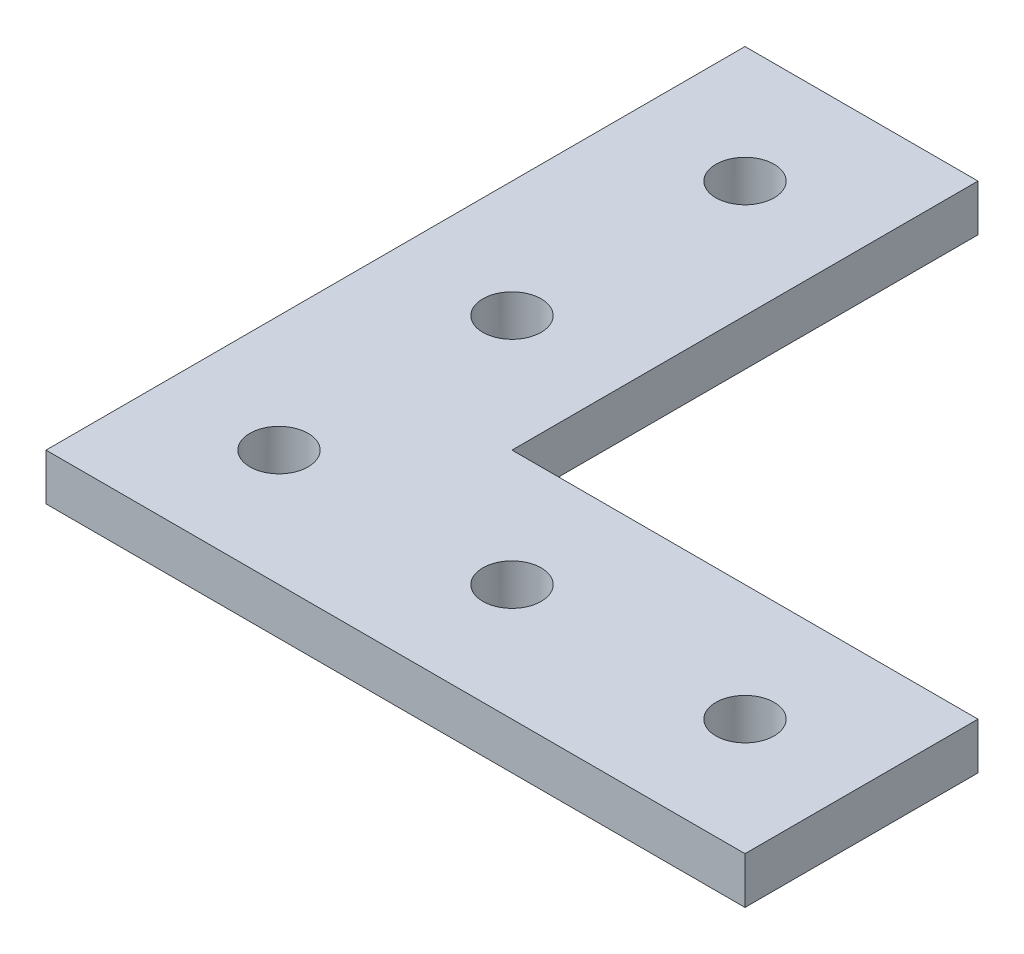
ISO-10303-21;
HEADER;
FILE_DESCRIPTION(('STEP AP214'),'2;1');
FILE_NAME('part.step','',(''),(''),'','','');
FILE_SCHEMA(('AUTOMOTIVE_DESIGN { 1 0 10303 214 1 1 1 1 }'));
ENDSEC;
DATA;
#1=APPLICATION_CONTEXT('core data for automotive mechanical design processes');
#2=APPLICATION_PROTOCOL_DEFINITION('international standard','automotive_design',2000,#1);
#3=PRODUCT_CONTEXT('',#1,'mechanical');
#4=PRODUCT('Part','Part','',(#3));
#5=PRODUCT_RELATED_PRODUCT_CATEGORY('part','',(#4));
#6=PRODUCT_DEFINITION_FORMATION('','',#4);
#7=PRODUCT_DEFINITION_CONTEXT('part definition',#1,'design');
#8=PRODUCT_DEFINITION('design','',#6,#7);
#9=PRODUCT_DEFINITION_SHAPE('','',#8);
#10=(LENGTH_UNIT() NAMED_UNIT(*) SI_UNIT(.MILLI.,.METRE.));
#11=(NAMED_UNIT(*) PLANE_ANGLE_UNIT() SI_UNIT($,.RADIAN.));
#12=(NAMED_UNIT(*) SI_UNIT($,.STERADIAN.) SOLID_ANGLE_UNIT());
#13=UNCERTAINTY_MEASURE_WITH_UNIT(LENGTH_MEASURE(1.E-05),#10,'distance_accuracy_value','');
#14=(GEOMETRIC_REPRESENTATION_CONTEXT(3) GLOBAL_UNCERTAINTY_ASSIGNED_CONTEXT((#13)) GLOBAL_UNIT_ASSIGNED_CONTEXT((#10,
#11,#12)) REPRESENTATION_CONTEXT('',''));
#15=CARTESIAN_POINT('',(0.,0.,0.));
#16=DIRECTION('',(0.,0.,1.));
#17=DIRECTION('',(1.,0.,0.));
#18=AXIS2_PLACEMENT_3D('',#15,#16,#17);
#19=CARTESIAN_POINT('',(76.2,5.08,0.));
#20=DIRECTION('',(0.,0.,-1.));
#21=DIRECTION('',(-1.,0.,0.));
#22=AXIS2_PLACEMENT_3D('',#19,#20,#21);
#23=PLANE('',#22);
#24=DIRECTION('',(1.,0.,0.));
#25=VECTOR('',#24,1.);
#26=CARTESIAN_POINT('',(76.2,0.,0.));
#27=LINE('',#26,#25);
#28=CARTESIAN_POINT('',(0.,0.,0.));
#29=VERTEX_POINT('',#28);
#30=CARTESIAN_POINT('',(76.2,0.,0.));
#31=VERTEX_POINT('',#30);
#32=EDGE_CURVE('E130',#29,#31,#27,.T.);
#33=ORIENTED_EDGE('',*,*,#32,.T.);
#34=DIRECTION('',(0.,-1.,0.));
#35=VECTOR('',#34,1.);
#36=CARTESIAN_POINT('',(76.2,5.08,0.));
#37=LINE('',#36,#35);
#38=CARTESIAN_POINT('',(76.2,5.08,0.));
#39=VERTEX_POINT('',#38);
#40=EDGE_CURVE('E11',#39,#31,#37,.T.);
#41=ORIENTED_EDGE('',*,*,#40,.F.);
#42=DIRECTION('',(1.,0.,0.));
#43=VECTOR('',#42,1.);
#44=CARTESIAN_POINT('',(76.2,5.08,0.));
#45=LINE('',#44,#43);
#46=CARTESIAN_POINT('',(0.,5.08,0.));
#47=VERTEX_POINT('',#46);
#48=EDGE_CURVE('E147',#47,#39,#45,.T.);
#49=ORIENTED_EDGE('',*,*,#48,.F.);
#50=DIRECTION('',(0.,-1.,0.));
#51=VECTOR('',#50,1.);
#52=CARTESIAN_POINT('',(0.,5.08,0.));
#53=LINE('',#52,#51);
#54=EDGE_CURVE('E126',#47,#29,#53,.T.);
#55=ORIENTED_EDGE('',*,*,#54,.T.);
#56=EDGE_LOOP('',(#33,#41,#49,#55));
#57=FACE_BOUND('',#56,.T.);
#58=ADVANCED_FACE('F39',(#57),#23,.F.);
#59=CARTESIAN_POINT('',(76.2,5.08,-25.4));
#60=DIRECTION('',(-1.,0.,0.));
#61=DIRECTION('',(0.,0.,1.));
#62=AXIS2_PLACEMENT_3D('',#59,#60,#61);
#63=PLANE('',#62);
#64=DIRECTION('',(0.,0.,-1.));
#65=VECTOR('',#64,1.);
#66=CARTESIAN_POINT('',(76.2,0.,-25.4));
#67=LINE('',#66,#65);
#68=CARTESIAN_POINT('',(76.2,0.,-25.4));
#69=VERTEX_POINT('',#68);
#70=EDGE_CURVE('E134',#31,#69,#67,.T.);
#71=ORIENTED_EDGE('',*,*,#70,.T.);
#72=DIRECTION('',(0.,-1.,0.));
#73=VECTOR('',#72,1.);
#74=CARTESIAN_POINT('',(76.2,5.08,-25.4));
#75=LINE('',#74,#73);
#76=CARTESIAN_POINT('',(76.2,5.08,-25.4));
#77=VERTEX_POINT('',#76);
#78=EDGE_CURVE('E49',#77,#69,#75,.T.);
#79=ORIENTED_EDGE('',*,*,#78,.F.);
#80=DIRECTION('',(0.,0.,-1.));
#81=VECTOR('',#80,1.);
#82=CARTESIAN_POINT('',(76.2,5.08,-25.4));
#83=LINE('',#82,#81);
#84=EDGE_CURVE('E95',#39,#77,#83,.T.);
#85=ORIENTED_EDGE('',*,*,#84,.F.);
#86=ORIENTED_EDGE('',*,*,#40,.T.);
#87=EDGE_LOOP('',(#71,#79,#85,#86));
#88=FACE_BOUND('',#87,.T.);
#89=ADVANCED_FACE('F187',(#88),#63,.F.);
#90=CARTESIAN_POINT('',(25.4,5.08,-25.4));
#91=DIRECTION('',(0.,0.,1.));
#92=DIRECTION('',(1.,0.,0.));
#93=AXIS2_PLACEMENT_3D('',#90,#91,#92);
#94=PLANE('',#93);
#95=DIRECTION('',(-1.,0.,0.));
#96=VECTOR('',#95,1.);
#97=CARTESIAN_POINT('',(25.4,0.,-25.4));
#98=LINE('',#97,#96);
#99=CARTESIAN_POINT('',(25.4,0.,-25.4));
#100=VERTEX_POINT('',#99);
#101=EDGE_CURVE('E138',#69,#100,#98,.T.);
#102=ORIENTED_EDGE('',*,*,#101,.T.);
#103=DIRECTION('',(0.,-1.,0.));
#104=VECTOR('',#103,1.);
#105=CARTESIAN_POINT('',(25.4,5.08,-25.4));
#106=LINE('',#105,#104);
#107=CARTESIAN_POINT('',(25.4,5.08,-25.4));
#108=VERTEX_POINT('',#107);
#109=EDGE_CURVE('E119',#108,#100,#106,.T.);
#110=ORIENTED_EDGE('',*,*,#109,.F.);
#111=DIRECTION('',(-1.,0.,0.));
#112=VECTOR('',#111,1.);
#113=CARTESIAN_POINT('',(25.4,5.08,-25.4));
#114=LINE('',#113,#112);
#115=EDGE_CURVE('E108',#77,#108,#114,.T.);
#116=ORIENTED_EDGE('',*,*,#115,.F.);
#117=ORIENTED_EDGE('',*,*,#78,.T.);
#118=EDGE_LOOP('',(#102,#110,#116,#117));
#119=FACE_BOUND('',#118,.T.);
#120=ADVANCED_FACE('F190',(#119),#94,.F.);
#121=CARTESIAN_POINT('',(25.4,5.08,-76.2));
#122=DIRECTION('',(-1.,0.,0.));
#123=DIRECTION('',(0.,0.,1.));
#124=AXIS2_PLACEMENT_3D('',#121,#122,#123);
#125=PLANE('',#124);
#126=DIRECTION('',(0.,0.,-1.));
#127=VECTOR('',#126,1.);
#128=CARTESIAN_POINT('',(25.4,0.,-76.2));
#129=LINE('',#128,#127);
#130=CARTESIAN_POINT('',(25.4,0.,-76.2));
#131=VERTEX_POINT('',#130);
#132=EDGE_CURVE('E117',#100,#131,#129,.T.);
#133=ORIENTED_EDGE('',*,*,#132,.T.);
#134=DIRECTION('',(0.,-1.,0.));
#135=VECTOR('',#134,1.);
#136=CARTESIAN_POINT('',(25.4,5.08,-76.2));
#137=LINE('',#136,#135);
#138=CARTESIAN_POINT('',(25.4,5.08,-76.2));
#139=VERTEX_POINT('',#138);
#140=EDGE_CURVE('E114',#139,#131,#137,.T.);
#141=ORIENTED_EDGE('',*,*,#140,.F.);
#142=DIRECTION('',(0.,0.,-1.));
#143=VECTOR('',#142,1.);
#144=CARTESIAN_POINT('',(25.4,5.08,-76.2));
#145=LINE('',#144,#143);
#146=EDGE_CURVE('E102',#108,#139,#145,.T.);
#147=ORIENTED_EDGE('',*,*,#146,.F.);
#148=ORIENTED_EDGE('',*,*,#109,.T.);
#149=EDGE_LOOP('',(#133,#141,#147,#148));
#150=FACE_BOUND('',#149,.T.);
#151=ADVANCED_FACE('F115',(#150),#125,.F.);
#152=CARTESIAN_POINT('',(0.,5.08,-76.2));
#153=DIRECTION('',(0.,0.,1.));
#154=DIRECTION('',(1.,0.,0.));
#155=AXIS2_PLACEMENT_3D('',#152,#153,#154);
#156=PLANE('',#155);
#157=DIRECTION('',(-1.,0.,0.));
#158=VECTOR('',#157,1.);
#159=CARTESIAN_POINT('',(0.,0.,-76.2));
#160=LINE('',#159,#158);
#161=CARTESIAN_POINT('',(0.,0.,-76.2));
#162=VERTEX_POINT('',#161);
#163=EDGE_CURVE('E81',#131,#162,#160,.T.);
#164=ORIENTED_EDGE('',*,*,#163,.T.);
#165=DIRECTION('',(0.,-1.,0.));
#166=VECTOR('',#165,1.);
#167=CARTESIAN_POINT('',(0.,5.08,-76.2));
#168=LINE('',#167,#166);
#169=CARTESIAN_POINT('',(0.,5.08,-76.2));
#170=VERTEX_POINT('',#169);
#171=EDGE_CURVE('E120',#170,#162,#168,.T.);
#172=ORIENTED_EDGE('',*,*,#171,.F.);
#173=DIRECTION('',(-1.,0.,0.));
#174=VECTOR('',#173,1.);
#175=CARTESIAN_POINT('',(0.,5.08,-76.2));
#176=LINE('',#175,#174);
#177=EDGE_CURVE('E106',#139,#170,#176,.T.);
#178=ORIENTED_EDGE('',*,*,#177,.F.);
#179=ORIENTED_EDGE('',*,*,#140,.T.);
#180=EDGE_LOOP('',(#164,#172,#178,#179));
#181=FACE_BOUND('',#180,.T.);
#182=ADVANCED_FACE('F122',(#181),#156,.F.);
#183=CARTESIAN_POINT('',(0.,5.08,0.));
#184=DIRECTION('',(1.,0.,0.));
#185=DIRECTION('',(0.,0.,-1.));
#186=AXIS2_PLACEMENT_3D('',#183,#184,#185);
#187=PLANE('',#186);
#188=DIRECTION('',(0.,0.,1.));
#189=VECTOR('',#188,1.);
#190=CARTESIAN_POINT('',(0.,0.,0.));
#191=LINE('',#190,#189);
#192=EDGE_CURVE('E87',#162,#29,#191,.T.);
#193=ORIENTED_EDGE('',*,*,#192,.T.);
#194=ORIENTED_EDGE('',*,*,#54,.F.);
#195=DIRECTION('',(0.,0.,1.));
#196=VECTOR('',#195,1.);
#197=CARTESIAN_POINT('',(0.,5.08,0.));
#198=LINE('',#197,#196);
#199=EDGE_CURVE('E58',#170,#47,#198,.T.);
#200=ORIENTED_EDGE('',*,*,#199,.F.);
#201=ORIENTED_EDGE('',*,*,#171,.T.);
#202=EDGE_LOOP('',(#193,#194,#200,#201));
#203=FACE_BOUND('',#202,.T.);
#204=ADVANCED_FACE('F195',(#203),#187,.F.);
#205=CARTESIAN_POINT('',(0.,5.08,0.));
#206=DIRECTION('',(0.,-1.,0.));
#207=DIRECTION('',(0.,0.,-1.));
#208=AXIS2_PLACEMENT_3D('',#205,#206,#207);
#209=PLANE('',#208);
#210=CARTESIAN_POINT('',(12.7,5.08,-63.5));
#211=DIRECTION('',(0.,1.,0.));
#212=DIRECTION('',(0.,0.,1.));
#213=AXIS2_PLACEMENT_3D('',#210,#211,#212);
#214=CIRCLE('',#213,3.175);
#215=CARTESIAN_POINT('',(12.7,5.08,-60.325));
#216=VERTEX_POINT('',#215);
#217=EDGE_CURVE('E300',#216,#216,#214,.T.);
#218=ORIENTED_EDGE('',*,*,#217,.F.);
#219=EDGE_LOOP('',(#218));
#220=FACE_BOUND('',#219,.T.);
#221=CARTESIAN_POINT('',(12.7,5.08,-38.1));
#222=DIRECTION('',(0.,1.,0.));
#223=DIRECTION('',(0.,0.,1.));
#224=AXIS2_PLACEMENT_3D('',#221,#222,#223);
#225=CIRCLE('',#224,3.175);
#226=CARTESIAN_POINT('',(12.7,5.08,-34.925));
#227=VERTEX_POINT('',#226);
#228=EDGE_CURVE('E304',#227,#227,#225,.T.);
#229=ORIENTED_EDGE('',*,*,#228,.F.);
#230=EDGE_LOOP('',(#229));
#231=FACE_BOUND('',#230,.T.);
#232=CARTESIAN_POINT('',(12.7,5.08,-12.7));
#233=DIRECTION('',(0.,1.,0.));
#234=DIRECTION('',(0.,0.,1.));
#235=AXIS2_PLACEMENT_3D('',#232,#233,#234);
#236=CIRCLE('',#235,3.175);
#237=CARTESIAN_POINT('',(12.7,5.08,-9.525));
#238=VERTEX_POINT('',#237);
#239=EDGE_CURVE('E177',#238,#238,#236,.T.);
#240=ORIENTED_EDGE('',*,*,#239,.F.);
#241=EDGE_LOOP('',(#240));
#242=FACE_BOUND('',#241,.T.);
#243=CARTESIAN_POINT('',(38.1,5.08,-12.7));
#244=DIRECTION('',(0.,1.,0.));
#245=DIRECTION('',(0.,0.,1.));
#246=AXIS2_PLACEMENT_3D('',#243,#244,#245);
#247=CIRCLE('',#246,3.175);
#248=CARTESIAN_POINT('',(38.1,5.08,-9.525));
#249=VERTEX_POINT('',#248);
#250=EDGE_CURVE('E163',#249,#249,#247,.T.);
#251=ORIENTED_EDGE('',*,*,#250,.F.);
#252=EDGE_LOOP('',(#251));
#253=FACE_BOUND('',#252,.T.);
#254=CARTESIAN_POINT('',(63.5,5.08,-12.7));
#255=DIRECTION('',(0.,1.,0.));
#256=DIRECTION('',(0.,0.,1.));
#257=AXIS2_PLACEMENT_3D('',#254,#255,#256);
#258=CIRCLE('',#257,3.175);
#259=CARTESIAN_POINT('',(63.5,5.08,-9.525));
#260=VERTEX_POINT('',#259);
#261=EDGE_CURVE('E159',#260,#260,#258,.T.);
#262=ORIENTED_EDGE('',*,*,#261,.F.);
#263=EDGE_LOOP('',(#262));
#264=FACE_BOUND('',#263,.T.);
#265=ORIENTED_EDGE('',*,*,#48,.T.);
#266=ORIENTED_EDGE('',*,*,#84,.T.);
#267=ORIENTED_EDGE('',*,*,#115,.T.);
#268=ORIENTED_EDGE('',*,*,#146,.T.);
#269=ORIENTED_EDGE('',*,*,#177,.T.);
#270=ORIENTED_EDGE('',*,*,#199,.T.);
#271=EDGE_LOOP('',(#265,#266,#267,#268,#269,#270));
#272=FACE_BOUND('',#271,.T.);
#273=ADVANCED_FACE('F104',(#220,#231,#242,#253,#264,#272),#209,.F.);
#274=CARTESIAN_POINT('',(0.,0.,0.));
#275=DIRECTION('',(0.,-1.,0.));
#276=DIRECTION('',(0.,0.,-1.));
#277=AXIS2_PLACEMENT_3D('',#274,#275,#276);
#278=PLANE('',#277);
#279=CARTESIAN_POINT('',(12.7,0.,-63.5));
#280=DIRECTION('',(0.,-1.,0.));
#281=DIRECTION('',(0.,0.,-1.));
#282=AXIS2_PLACEMENT_3D('',#279,#280,#281);
#283=CIRCLE('',#282,3.175);
#284=CARTESIAN_POINT('',(12.7,0.,-66.675));
#285=VERTEX_POINT('',#284);
#286=EDGE_CURVE('E42',#285,#285,#283,.T.);
#287=ORIENTED_EDGE('',*,*,#286,.F.);
#288=EDGE_LOOP('',(#287));
#289=FACE_BOUND('',#288,.T.);
#290=CARTESIAN_POINT('',(12.7,0.,-38.1));
#291=DIRECTION('',(0.,-1.,0.));
#292=DIRECTION('',(0.,0.,-1.));
#293=AXIS2_PLACEMENT_3D('',#290,#291,#292);
#294=CIRCLE('',#293,3.175);
#295=CARTESIAN_POINT('',(12.7,0.,-41.275));
#296=VERTEX_POINT('',#295);
#297=EDGE_CURVE('E309',#296,#296,#294,.T.);
#298=ORIENTED_EDGE('',*,*,#297,.F.);
#299=EDGE_LOOP('',(#298));
#300=FACE_BOUND('',#299,.T.);
#301=CARTESIAN_POINT('',(12.7,0.,-12.7));
#302=DIRECTION('',(0.,-1.,0.));
#303=DIRECTION('',(0.,0.,-1.));
#304=AXIS2_PLACEMENT_3D('',#301,#302,#303);
#305=CIRCLE('',#304,3.175);
#306=CARTESIAN_POINT('',(12.7,0.,-15.875));
#307=VERTEX_POINT('',#306);
#308=EDGE_CURVE('E171',#307,#307,#305,.T.);
#309=ORIENTED_EDGE('',*,*,#308,.F.);
#310=EDGE_LOOP('',(#309));
#311=FACE_BOUND('',#310,.T.);
#312=CARTESIAN_POINT('',(38.1,0.,-12.7));
#313=DIRECTION('',(0.,-1.,0.));
#314=DIRECTION('',(0.,0.,-1.));
#315=AXIS2_PLACEMENT_3D('',#312,#313,#314);
#316=CIRCLE('',#315,3.175);
#317=CARTESIAN_POINT('',(38.1,0.,-15.875));
#318=VERTEX_POINT('',#317);
#319=EDGE_CURVE('E160',#318,#318,#316,.T.);
#320=ORIENTED_EDGE('',*,*,#319,.F.);
#321=EDGE_LOOP('',(#320));
#322=FACE_BOUND('',#321,.T.);
#323=CARTESIAN_POINT('',(63.5,0.,-12.7));
#324=DIRECTION('',(0.,-1.,0.));
#325=DIRECTION('',(0.,0.,-1.));
#326=AXIS2_PLACEMENT_3D('',#323,#324,#325);
#327=CIRCLE('',#326,3.175);
#328=CARTESIAN_POINT('',(63.5,0.,-15.875));
#329=VERTEX_POINT('',#328);
#330=EDGE_CURVE('E135',#329,#329,#327,.T.);
#331=ORIENTED_EDGE('',*,*,#330,.F.);
#332=EDGE_LOOP('',(#331));
#333=FACE_BOUND('',#332,.T.);
#334=ORIENTED_EDGE('',*,*,#32,.F.);
#335=ORIENTED_EDGE('',*,*,#192,.F.);
#336=ORIENTED_EDGE('',*,*,#163,.F.);
#337=ORIENTED_EDGE('',*,*,#132,.F.);
#338=ORIENTED_EDGE('',*,*,#101,.F.);
#339=ORIENTED_EDGE('',*,*,#70,.F.);
#340=EDGE_LOOP('',(#334,#335,#336,#337,#338,#339));
#341=FACE_BOUND('',#340,.T.);
#342=ADVANCED_FACE('F193',(#289,#300,#311,#322,#333,#341),#278,.T.);
#343=CARTESIAN_POINT('',(63.5,5.08,-12.7));
#344=DIRECTION('',(0.,1.,0.));
#345=DIRECTION('',(0.,0.,1.));
#346=AXIS2_PLACEMENT_3D('',#343,#344,#345);
#347=CYLINDRICAL_SURFACE('',#346,3.175);
#348=ORIENTED_EDGE('',*,*,#330,.T.);
#349=EDGE_LOOP('',(#348));
#350=FACE_BOUND('',#349,.T.);
#351=ORIENTED_EDGE('',*,*,#261,.T.);
#352=EDGE_LOOP('',(#351));
#353=FACE_BOUND('',#352,.T.);
#354=ADVANCED_FACE('F243',(#350,#353),#347,.F.);
#355=CARTESIAN_POINT('',(38.1,5.08,-12.7));
#356=DIRECTION('',(0.,1.,0.));
#357=DIRECTION('',(0.,0.,1.));
#358=AXIS2_PLACEMENT_3D('',#355,#356,#357);
#359=CYLINDRICAL_SURFACE('',#358,3.175);
#360=ORIENTED_EDGE('',*,*,#319,.T.);
#361=EDGE_LOOP('',(#360));
#362=FACE_BOUND('',#361,.T.);
#363=ORIENTED_EDGE('',*,*,#250,.T.);
#364=EDGE_LOOP('',(#363));
#365=FACE_BOUND('',#364,.T.);
#366=ADVANCED_FACE('F252',(#362,#365),#359,.F.);
#367=CARTESIAN_POINT('',(12.7,5.08,-12.7));
#368=DIRECTION('',(0.,1.,0.));
#369=DIRECTION('',(0.,0.,1.));
#370=AXIS2_PLACEMENT_3D('',#367,#368,#369);
#371=CYLINDRICAL_SURFACE('',#370,3.175);
#372=ORIENTED_EDGE('',*,*,#308,.T.);
#373=EDGE_LOOP('',(#372));
#374=FACE_BOUND('',#373,.T.);
#375=ORIENTED_EDGE('',*,*,#239,.T.);
#376=EDGE_LOOP('',(#375));
#377=FACE_BOUND('',#376,.T.);
#378=ADVANCED_FACE('F262',(#374,#377),#371,.F.);
#379=CARTESIAN_POINT('',(12.7,5.08,-38.1));
#380=DIRECTION('',(0.,1.,0.));
#381=DIRECTION('',(0.,0.,1.));
#382=AXIS2_PLACEMENT_3D('',#379,#380,#381);
#383=CYLINDRICAL_SURFACE('',#382,3.175);
#384=ORIENTED_EDGE('',*,*,#297,.T.);
#385=EDGE_LOOP('',(#384));
#386=FACE_BOUND('',#385,.T.);
#387=ORIENTED_EDGE('',*,*,#228,.T.);
#388=EDGE_LOOP('',(#387));
#389=FACE_BOUND('',#388,.T.);
#390=ADVANCED_FACE('F271',(#386,#389),#383,.F.);
#391=CARTESIAN_POINT('',(12.7,5.08,-63.5));
#392=DIRECTION('',(0.,1.,0.));
#393=DIRECTION('',(0.,0.,1.));
#394=AXIS2_PLACEMENT_3D('',#391,#392,#393);
#395=CYLINDRICAL_SURFACE('',#394,3.175);
#396=ORIENTED_EDGE('',*,*,#286,.T.);
#397=EDGE_LOOP('',(#396));
#398=FACE_BOUND('',#397,.T.);
#399=ORIENTED_EDGE('',*,*,#217,.T.);
#400=EDGE_LOOP('',(#399));
#401=FACE_BOUND('',#400,.T.);
#402=ADVANCED_FACE('F281',(#398,#401),#395,.F.);
#403=CLOSED_SHELL('',(#58,#89,#120,#151,#182,#204,#273,#342,#354,#366,#378,#390,#402));
#404=MANIFOLD_SOLID_BREP('B2',#403);
#405=ADVANCED_BREP_SHAPE_REPRESENTATION('',(#18,#404),#14);
#406=SHAPE_DEFINITION_REPRESENTATION(#9,#405);
ENDSEC;
END-ISO-10303-21;
